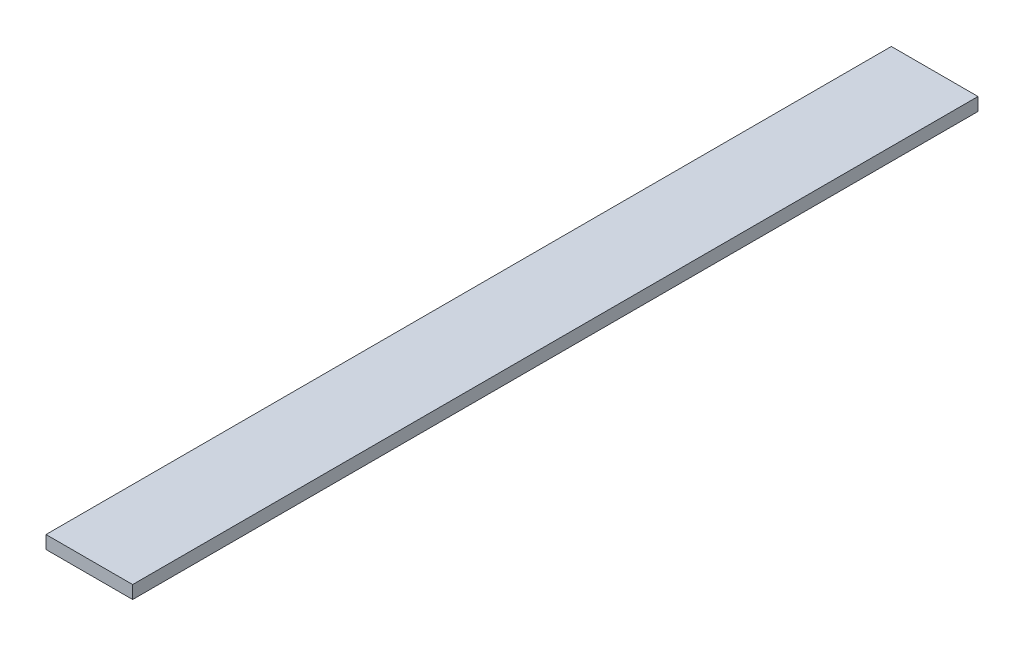
ISO-10303-21;
HEADER;
FILE_DESCRIPTION(('STEP AP214'),'2;1');
FILE_NAME('part.step','',(''),(''),'','','');
FILE_SCHEMA(('AUTOMOTIVE_DESIGN { 1 0 10303 214 1 1 1 1 }'));
ENDSEC;
DATA;
#1=APPLICATION_CONTEXT('core data for automotive mechanical design processes');
#2=APPLICATION_PROTOCOL_DEFINITION('international standard','automotive_design',2000,#1);
#3=PRODUCT_CONTEXT('',#1,'mechanical');
#4=PRODUCT('Part','Part','',(#3));
#5=PRODUCT_RELATED_PRODUCT_CATEGORY('part','',(#4));
#6=PRODUCT_DEFINITION_FORMATION('','',#4);
#7=PRODUCT_DEFINITION_CONTEXT('part definition',#1,'design');
#8=PRODUCT_DEFINITION('design','',#6,#7);
#9=PRODUCT_DEFINITION_SHAPE('','',#8);
#10=(LENGTH_UNIT() NAMED_UNIT(*) SI_UNIT(.MILLI.,.METRE.));
#11=(NAMED_UNIT(*) PLANE_ANGLE_UNIT() SI_UNIT($,.RADIAN.));
#12=(NAMED_UNIT(*) SI_UNIT($,.STERADIAN.) SOLID_ANGLE_UNIT());
#13=UNCERTAINTY_MEASURE_WITH_UNIT(LENGTH_MEASURE(1.E-05),#10,'distance_accuracy_value','');
#14=(GEOMETRIC_REPRESENTATION_CONTEXT(3) GLOBAL_UNCERTAINTY_ASSIGNED_CONTEXT((#13)) GLOBAL_UNIT_ASSIGNED_CONTEXT((#10,
#11,#12)) REPRESENTATION_CONTEXT('',''));
#15=CARTESIAN_POINT('',(0.,0.,0.));
#16=DIRECTION('',(0.,0.,1.));
#17=DIRECTION('',(1.,0.,0.));
#18=AXIS2_PLACEMENT_3D('',#15,#16,#17);
#19=CARTESIAN_POINT('',(1.775,-0.455,-2.41));
#20=DIRECTION('',(0.,-1.,0.));
#21=DIRECTION('',(0.,0.,-1.));
#22=AXIS2_PLACEMENT_3D('',#19,#20,#21);
#23=PLANE('',#22);
#24=DIRECTION('',(0.,0.,-1.));
#25=VECTOR('',#24,1.);
#26=CARTESIAN_POINT('',(1.775,-0.455,0.));
#27=LINE('',#26,#25);
#28=CARTESIAN_POINT('',(1.775,-0.455,-2.41));
#29=VERTEX_POINT('',#28);
#30=CARTESIAN_POINT('',(1.775,-0.455,-6.8000000000524));
#31=VERTEX_POINT('',#30);
#32=EDGE_CURVE('E68',#29,#31,#27,.T.);
#33=ORIENTED_EDGE('',*,*,#32,.T.);
#34=DIRECTION('',(-1.,0.,0.));
#35=VECTOR('',#34,1.);
#36=CARTESIAN_POINT('',(-5.84407419636889,-0.455,-6.8000000001048));
#37=LINE('',#36,#35);
#38=CARTESIAN_POINT('',(2.225,-0.455,-6.8000000000262));
#39=VERTEX_POINT('',#38);
#40=EDGE_CURVE('E20',#39,#31,#37,.T.);
#41=ORIENTED_EDGE('',*,*,#40,.F.);
#42=DIRECTION('',(0.,0.,-1.));
#43=VECTOR('',#42,1.);
#44=CARTESIAN_POINT('',(2.225,-0.455,0.));
#45=LINE('',#44,#43);
#46=CARTESIAN_POINT('',(2.225,-0.455,-2.41));
#47=VERTEX_POINT('',#46);
#48=EDGE_CURVE('E58',#47,#39,#45,.T.);
#49=ORIENTED_EDGE('',*,*,#48,.F.);
#50=DIRECTION('',(1.,0.,0.));
#51=VECTOR('',#50,1.);
#52=CARTESIAN_POINT('',(1.775,-0.455,-2.41));
#53=LINE('',#52,#51);
#54=EDGE_CURVE('E53',#29,#47,#53,.T.);
#55=ORIENTED_EDGE('',*,*,#54,.F.);
#56=EDGE_LOOP('',(#33,#41,#49,#55));
#57=FACE_BOUND('',#56,.T.);
#58=ADVANCED_FACE('F17',(#57),#23,.T.);
#59=CARTESIAN_POINT('',(-5.84407419636889,-0.801967148131412,-6.8000000001048));
#60=DIRECTION('',(0.,0.,-1.));
#61=DIRECTION('',(-1.,0.,0.));
#62=AXIS2_PLACEMENT_3D('',#59,#60,#61);
#63=PLANE('',#62);
#64=DIRECTION('',(0.,1.,0.));
#65=VECTOR('',#64,1.);
#66=CARTESIAN_POINT('',(1.775,0.,-6.8));
#67=LINE('',#66,#65);
#68=CARTESIAN_POINT('',(1.775,-0.387500000000005,-6.8000000000786));
#69=VERTEX_POINT('',#68);
#70=EDGE_CURVE('E79',#31,#69,#67,.T.);
#71=ORIENTED_EDGE('',*,*,#70,.T.);
#72=DIRECTION('',(1.,0.,0.));
#73=VECTOR('',#72,1.);
#74=CARTESIAN_POINT('',(-4.67198901107201,-0.387499999999984,-6.8000000001048));
#75=LINE('',#74,#73);
#76=CARTESIAN_POINT('',(2.225,-0.387500000000006,-6.8000000000786));
#77=VERTEX_POINT('',#76);
#78=EDGE_CURVE('E74',#69,#77,#75,.T.);
#79=ORIENTED_EDGE('',*,*,#78,.T.);
#80=DIRECTION('',(0.,1.,0.));
#81=VECTOR('',#80,1.);
#82=CARTESIAN_POINT('',(2.225,0.,-6.8));
#83=LINE('',#82,#81);
#84=EDGE_CURVE('E63',#39,#77,#83,.T.);
#85=ORIENTED_EDGE('',*,*,#84,.F.);
#86=ORIENTED_EDGE('',*,*,#40,.T.);
#87=EDGE_LOOP('',(#71,#79,#85,#86));
#88=FACE_BOUND('',#87,.T.);
#89=ADVANCED_FACE('F73',(#88),#63,.T.);
#90=CARTESIAN_POINT('',(2.225,0.,0.));
#91=DIRECTION('',(1.,0.,0.));
#92=DIRECTION('',(0.,0.,-1.));
#93=AXIS2_PLACEMENT_3D('',#90,#91,#92);
#94=PLANE('',#93);
#95=DIRECTION('',(0.,0.,1.));
#96=VECTOR('',#95,1.);
#97=CARTESIAN_POINT('',(2.225,-0.387500000000007,-6.8000000001048));
#98=LINE('',#97,#96);
#99=CARTESIAN_POINT('',(2.225,-0.387500000000005,-2.41));
#100=VERTEX_POINT('',#99);
#101=EDGE_CURVE('E84',#77,#100,#98,.T.);
#102=ORIENTED_EDGE('',*,*,#101,.T.);
#103=DIRECTION('',(0.,1.,0.));
#104=VECTOR('',#103,1.);
#105=CARTESIAN_POINT('',(2.225,-0.3875,-2.41));
#106=LINE('',#105,#104);
#107=EDGE_CURVE('E65',#47,#100,#106,.T.);
#108=ORIENTED_EDGE('',*,*,#107,.F.);
#109=ORIENTED_EDGE('',*,*,#48,.T.);
#110=ORIENTED_EDGE('',*,*,#84,.T.);
#111=EDGE_LOOP('',(#102,#108,#109,#110));
#112=FACE_BOUND('',#111,.T.);
#113=ADVANCED_FACE('F61',(#112),#94,.T.);
#114=CARTESIAN_POINT('',(1.775,-0.3875,-2.41));
#115=DIRECTION('',(0.,0.,1.));
#116=DIRECTION('',(1.,0.,0.));
#117=AXIS2_PLACEMENT_3D('',#114,#115,#116);
#118=PLANE('',#117);
#119=DIRECTION('',(1.,0.,0.));
#120=VECTOR('',#119,1.);
#121=CARTESIAN_POINT('',(-4.67198901107201,-0.387499999999984,-2.41));
#122=LINE('',#121,#120);
#123=CARTESIAN_POINT('',(1.775,-0.387500000000003,-2.41));
#124=VERTEX_POINT('',#123);
#125=EDGE_CURVE('E26',#100,#124,#122,.F.);
#126=ORIENTED_EDGE('',*,*,#125,.T.);
#127=DIRECTION('',(0.,1.,0.));
#128=VECTOR('',#127,1.);
#129=CARTESIAN_POINT('',(1.775,0.,-2.41));
#130=LINE('',#129,#128);
#131=EDGE_CURVE('E34',#124,#29,#130,.F.);
#132=ORIENTED_EDGE('',*,*,#131,.T.);
#133=ORIENTED_EDGE('',*,*,#54,.T.);
#134=ORIENTED_EDGE('',*,*,#107,.T.);
#135=EDGE_LOOP('',(#126,#132,#133,#134));
#136=FACE_BOUND('',#135,.T.);
#137=ADVANCED_FACE('F88',(#136),#118,.T.);
#138=CARTESIAN_POINT('',(1.775,0.,0.));
#139=DIRECTION('',(1.,0.,0.));
#140=DIRECTION('',(0.,0.,-1.));
#141=AXIS2_PLACEMENT_3D('',#138,#139,#140);
#142=PLANE('',#141);
#143=ORIENTED_EDGE('',*,*,#131,.F.);
#144=DIRECTION('',(0.,0.,1.));
#145=VECTOR('',#144,1.);
#146=CARTESIAN_POINT('',(1.775,-0.387500000000006,-6.8000000001048));
#147=LINE('',#146,#145);
#148=EDGE_CURVE('E11',#124,#69,#147,.F.);
#149=ORIENTED_EDGE('',*,*,#148,.T.);
#150=ORIENTED_EDGE('',*,*,#70,.F.);
#151=ORIENTED_EDGE('',*,*,#32,.F.);
#152=EDGE_LOOP('',(#143,#149,#150,#151));
#153=FACE_BOUND('',#152,.T.);
#154=ADVANCED_FACE('F91',(#153),#142,.F.);
#155=CARTESIAN_POINT('',(-4.67198901107201,-0.387499999999984,-6.8000000001048));
#156=DIRECTION('',(0.,-1.,0.));
#157=DIRECTION('',(1.,0.,0.));
#158=AXIS2_PLACEMENT_3D('',#155,#156,#157);
#159=PLANE('',#158);
#160=ORIENTED_EDGE('',*,*,#125,.F.);
#161=ORIENTED_EDGE('',*,*,#101,.F.);
#162=ORIENTED_EDGE('',*,*,#78,.F.);
#163=ORIENTED_EDGE('',*,*,#148,.F.);
#164=EDGE_LOOP('',(#160,#161,#162,#163));
#165=FACE_BOUND('',#164,.T.);
#166=ADVANCED_FACE('F90',(#165),#159,.F.);
#167=CLOSED_SHELL('',(#58,#89,#113,#137,#154,#166));
#168=MANIFOLD_SOLID_BREP('B1',#167);
#169=ADVANCED_BREP_SHAPE_REPRESENTATION('',(#18,#168),#14);
#170=SHAPE_DEFINITION_REPRESENTATION(#9,#169);
ENDSEC;
END-ISO-10303-21;
